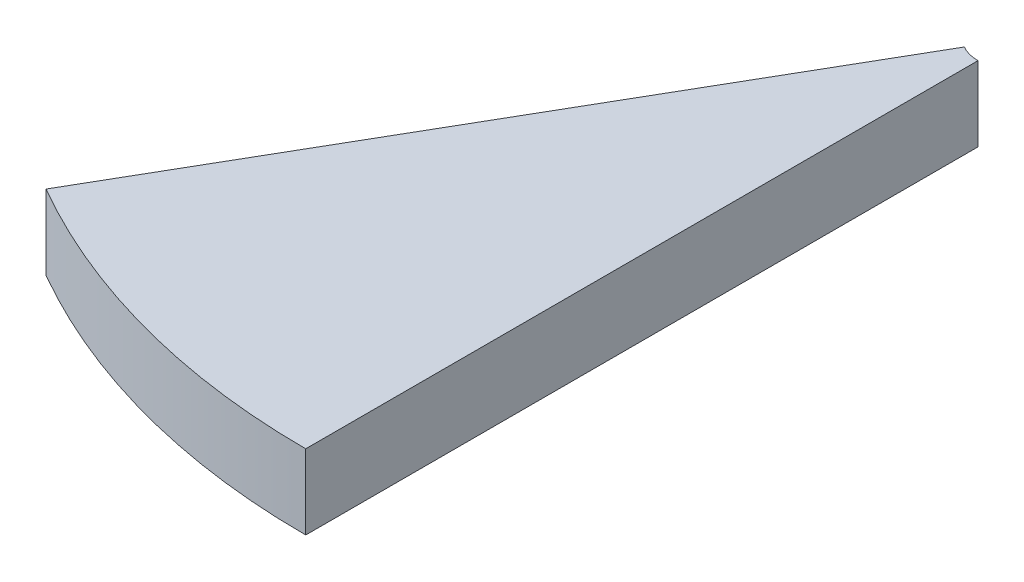
ISO-10303-21;
HEADER;
FILE_DESCRIPTION(('STEP AP214'),'2;1');
FILE_NAME('part.step','',(''),(''),'','','');
FILE_SCHEMA(('AUTOMOTIVE_DESIGN { 1 0 10303 214 1 1 1 1 }'));
ENDSEC;
DATA;
#1=APPLICATION_CONTEXT('core data for automotive mechanical design processes');
#2=APPLICATION_PROTOCOL_DEFINITION('international standard','automotive_design',2000,#1);
#3=PRODUCT_CONTEXT('',#1,'mechanical');
#4=PRODUCT('Part','Part','',(#3));
#5=PRODUCT_RELATED_PRODUCT_CATEGORY('part','',(#4));
#6=PRODUCT_DEFINITION_FORMATION('','',#4);
#7=PRODUCT_DEFINITION_CONTEXT('part definition',#1,'design');
#8=PRODUCT_DEFINITION('design','',#6,#7);
#9=PRODUCT_DEFINITION_SHAPE('','',#8);
#10=(LENGTH_UNIT() NAMED_UNIT(*) SI_UNIT(.MILLI.,.METRE.));
#11=(NAMED_UNIT(*) PLANE_ANGLE_UNIT() SI_UNIT($,.RADIAN.));
#12=(NAMED_UNIT(*) SI_UNIT($,.STERADIAN.) SOLID_ANGLE_UNIT());
#13=UNCERTAINTY_MEASURE_WITH_UNIT(LENGTH_MEASURE(1.E-05),#10,'distance_accuracy_value','');
#14=(GEOMETRIC_REPRESENTATION_CONTEXT(3) GLOBAL_UNCERTAINTY_ASSIGNED_CONTEXT((#13)) GLOBAL_UNIT_ASSIGNED_CONTEXT((#10,
#11,#12)) REPRESENTATION_CONTEXT('',''));
#15=CARTESIAN_POINT('',(0.,0.,0.));
#16=DIRECTION('',(0.,0.,1.));
#17=DIRECTION('',(1.,0.,0.));
#18=AXIS2_PLACEMENT_3D('',#15,#16,#17);
#19=CARTESIAN_POINT('',(0.,40.,0.));
#20=DIRECTION('',(0.866025403784442,0.,0.499999999999994));
#21=DIRECTION('',(0.499999999999994,0.,-0.866025403784442));
#22=AXIS2_PLACEMENT_3D('',#19,#20,#21);
#23=PLANE('',#22);
#24=DIRECTION('',(-0.499999999999994,0.,0.866025403784442));
#25=VECTOR('',#24,1.);
#26=CARTESIAN_POINT('',(0.,0.,0.));
#27=LINE('',#26,#25);
#28=CARTESIAN_POINT('',(-9.99999999999988,0.,17.3205080756888));
#29=VERTEX_POINT('',#28);
#30=CARTESIAN_POINT('',(-189.999999999998,0.,329.089653438088));
#31=VERTEX_POINT('',#30);
#32=EDGE_CURVE('E102',#29,#31,#27,.T.);
#33=ORIENTED_EDGE('',*,*,#32,.T.);
#34=DIRECTION('',(0.,-1.,0.));
#35=VECTOR('',#34,1.);
#36=CARTESIAN_POINT('',(-189.999999999998,40.,329.089653438088));
#37=LINE('',#36,#35);
#38=CARTESIAN_POINT('',(-189.999999999998,40.,329.089653438088));
#39=VERTEX_POINT('',#38);
#40=EDGE_CURVE('E11',#39,#31,#37,.T.);
#41=ORIENTED_EDGE('',*,*,#40,.F.);
#42=DIRECTION('',(-0.499999999999994,0.,0.866025403784442));
#43=VECTOR('',#42,1.);
#44=CARTESIAN_POINT('',(0.,40.,0.));
#45=LINE('',#44,#43);
#46=CARTESIAN_POINT('',(-9.99999999999988,40.,17.3205080756888));
#47=VERTEX_POINT('',#46);
#48=EDGE_CURVE('E88',#47,#39,#45,.T.);
#49=ORIENTED_EDGE('',*,*,#48,.F.);
#50=DIRECTION('',(0.,-1.,0.));
#51=VECTOR('',#50,1.);
#52=CARTESIAN_POINT('',(-9.99999999999988,40.,17.3205080756888));
#53=LINE('',#52,#51);
#54=EDGE_CURVE('E55',#47,#29,#53,.T.);
#55=ORIENTED_EDGE('',*,*,#54,.T.);
#56=EDGE_LOOP('',(#33,#41,#49,#55));
#57=FACE_BOUND('',#56,.T.);
#58=ADVANCED_FACE('F39',(#57),#23,.F.);
#59=CARTESIAN_POINT('',(0.,40.,0.));
#60=DIRECTION('',(0.,-1.,0.));
#61=DIRECTION('',(0.,0.,-1.));
#62=AXIS2_PLACEMENT_3D('',#59,#60,#61);
#63=CYLINDRICAL_SURFACE('',#62,380.);
#64=CARTESIAN_POINT('',(0.,0.,0.));
#65=DIRECTION('',(0.,1.,0.));
#66=DIRECTION('',(0.,0.,1.));
#67=AXIS2_PLACEMENT_3D('',#64,#65,#66);
#68=CIRCLE('',#67,380.);
#69=CARTESIAN_POINT('',(0.,0.,380.));
#70=VERTEX_POINT('',#69);
#71=EDGE_CURVE('E93',#31,#70,#68,.T.);
#72=ORIENTED_EDGE('',*,*,#71,.T.);
#73=DIRECTION('',(0.,-1.,0.));
#74=VECTOR('',#73,1.);
#75=CARTESIAN_POINT('',(0.,40.,380.));
#76=LINE('',#75,#74);
#77=CARTESIAN_POINT('',(0.,40.,380.));
#78=VERTEX_POINT('',#77);
#79=EDGE_CURVE('E47',#78,#70,#76,.T.);
#80=ORIENTED_EDGE('',*,*,#79,.F.);
#81=CARTESIAN_POINT('',(0.,40.,0.));
#82=DIRECTION('',(0.,1.,0.));
#83=DIRECTION('',(0.,0.,1.));
#84=AXIS2_PLACEMENT_3D('',#81,#82,#83);
#85=CIRCLE('',#84,380.);
#86=EDGE_CURVE('E81',#39,#78,#85,.T.);
#87=ORIENTED_EDGE('',*,*,#86,.F.);
#88=ORIENTED_EDGE('',*,*,#40,.T.);
#89=EDGE_LOOP('',(#72,#80,#87,#88));
#90=FACE_BOUND('',#89,.T.);
#91=ADVANCED_FACE('F92',(#90),#63,.T.);
#92=CARTESIAN_POINT('',(0.,40.,0.));
#93=DIRECTION('',(-1.,0.,0.));
#94=DIRECTION('',(0.,0.,1.));
#95=AXIS2_PLACEMENT_3D('',#92,#93,#94);
#96=PLANE('',#95);
#97=DIRECTION('',(0.,0.,-1.));
#98=VECTOR('',#97,1.);
#99=CARTESIAN_POINT('',(0.,0.,0.));
#100=LINE('',#99,#98);
#101=CARTESIAN_POINT('',(0.,0.,20.));
#102=VERTEX_POINT('',#101);
#103=EDGE_CURVE('E105',#70,#102,#100,.T.);
#104=ORIENTED_EDGE('',*,*,#103,.T.);
#105=DIRECTION('',(0.,-1.,0.));
#106=VECTOR('',#105,1.);
#107=CARTESIAN_POINT('',(0.,40.,20.));
#108=LINE('',#107,#106);
#109=CARTESIAN_POINT('',(0.,40.,20.));
#110=VERTEX_POINT('',#109);
#111=EDGE_CURVE('E70',#110,#102,#108,.T.);
#112=ORIENTED_EDGE('',*,*,#111,.F.);
#113=DIRECTION('',(0.,0.,-1.));
#114=VECTOR('',#113,1.);
#115=CARTESIAN_POINT('',(0.,40.,0.));
#116=LINE('',#115,#114);
#117=EDGE_CURVE('E87',#78,#110,#116,.T.);
#118=ORIENTED_EDGE('',*,*,#117,.F.);
#119=ORIENTED_EDGE('',*,*,#79,.T.);
#120=EDGE_LOOP('',(#104,#112,#118,#119));
#121=FACE_BOUND('',#120,.T.);
#122=ADVANCED_FACE('F96',(#121),#96,.F.);
#123=CARTESIAN_POINT('',(0.,40.,0.));
#124=DIRECTION('',(0.,-1.,0.));
#125=DIRECTION('',(0.,0.,-1.));
#126=AXIS2_PLACEMENT_3D('',#123,#124,#125);
#127=CYLINDRICAL_SURFACE('',#126,20.);
#128=CARTESIAN_POINT('',(0.,0.,0.));
#129=DIRECTION('',(0.,1.,0.));
#130=DIRECTION('',(0.,0.,1.));
#131=AXIS2_PLACEMENT_3D('',#128,#129,#130);
#132=CIRCLE('',#131,20.);
#133=EDGE_CURVE('E107',#29,#102,#132,.T.);
#134=ORIENTED_EDGE('',*,*,#133,.F.);
#135=ORIENTED_EDGE('',*,*,#54,.F.);
#136=CARTESIAN_POINT('',(0.,40.,0.));
#137=DIRECTION('',(0.,1.,0.));
#138=DIRECTION('',(0.,0.,1.));
#139=AXIS2_PLACEMENT_3D('',#136,#137,#138);
#140=CIRCLE('',#139,20.);
#141=EDGE_CURVE('E97',#47,#110,#140,.T.);
#142=ORIENTED_EDGE('',*,*,#141,.T.);
#143=ORIENTED_EDGE('',*,*,#111,.T.);
#144=EDGE_LOOP('',(#134,#135,#142,#143));
#145=FACE_BOUND('',#144,.T.);
#146=ADVANCED_FACE('F113',(#145),#127,.F.);
#147=CARTESIAN_POINT('',(0.,40.,0.));
#148=DIRECTION('',(0.,1.,0.));
#149=DIRECTION('',(0.,0.,1.));
#150=AXIS2_PLACEMENT_3D('',#147,#148,#149);
#151=PLANE('',#150);
#152=ORIENTED_EDGE('',*,*,#48,.T.);
#153=ORIENTED_EDGE('',*,*,#86,.T.);
#154=ORIENTED_EDGE('',*,*,#117,.T.);
#155=ORIENTED_EDGE('',*,*,#141,.F.);
#156=EDGE_LOOP('',(#152,#153,#154,#155));
#157=FACE_BOUND('',#156,.T.);
#158=ADVANCED_FACE('F84',(#157),#151,.T.);
#159=CARTESIAN_POINT('',(0.,0.,0.));
#160=DIRECTION('',(0.,1.,0.));
#161=DIRECTION('',(0.,0.,1.));
#162=AXIS2_PLACEMENT_3D('',#159,#160,#161);
#163=PLANE('',#162);
#164=ORIENTED_EDGE('',*,*,#32,.F.);
#165=ORIENTED_EDGE('',*,*,#133,.T.);
#166=ORIENTED_EDGE('',*,*,#103,.F.);
#167=ORIENTED_EDGE('',*,*,#71,.F.);
#168=EDGE_LOOP('',(#164,#165,#166,#167));
#169=FACE_BOUND('',#168,.T.);
#170=ADVANCED_FACE('F112',(#169),#163,.F.);
#171=CLOSED_SHELL('',(#58,#91,#122,#146,#158,#170));
#172=MANIFOLD_SOLID_BREP('B2',#171);
#173=ADVANCED_BREP_SHAPE_REPRESENTATION('',(#18,#172),#14);
#174=SHAPE_DEFINITION_REPRESENTATION(#9,#173);
ENDSEC;
END-ISO-10303-21;
